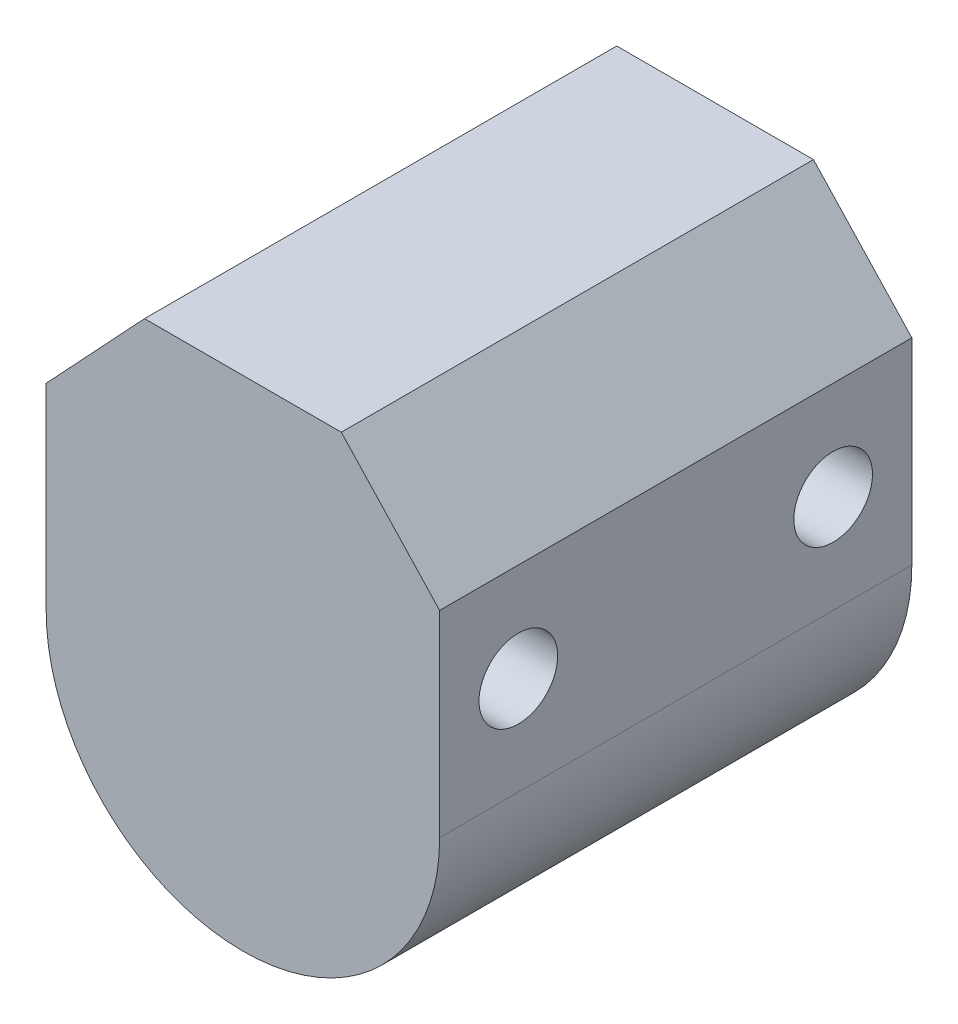
ISO-10303-21;
HEADER;
FILE_DESCRIPTION(('STEP AP214'),'2;1');
FILE_NAME('part.step','',(''),(''),'','','');
FILE_SCHEMA(('AUTOMOTIVE_DESIGN { 1 0 10303 214 1 1 1 1 }'));
ENDSEC;
DATA;
#1=APPLICATION_CONTEXT('core data for automotive mechanical design processes');
#2=APPLICATION_PROTOCOL_DEFINITION('international standard','automotive_design',2000,#1);
#3=PRODUCT_CONTEXT('',#1,'mechanical');
#4=PRODUCT('Part','Part','',(#3));
#5=PRODUCT_RELATED_PRODUCT_CATEGORY('part','',(#4));
#6=PRODUCT_DEFINITION_FORMATION('','',#4);
#7=PRODUCT_DEFINITION_CONTEXT('part definition',#1,'design');
#8=PRODUCT_DEFINITION('design','',#6,#7);
#9=PRODUCT_DEFINITION_SHAPE('','',#8);
#10=(LENGTH_UNIT() NAMED_UNIT(*) SI_UNIT(.MILLI.,.METRE.));
#11=(NAMED_UNIT(*) PLANE_ANGLE_UNIT() SI_UNIT($,.RADIAN.));
#12=(NAMED_UNIT(*) SI_UNIT($,.STERADIAN.) SOLID_ANGLE_UNIT());
#13=UNCERTAINTY_MEASURE_WITH_UNIT(LENGTH_MEASURE(1.E-05),#10,'distance_accuracy_value','');
#14=(GEOMETRIC_REPRESENTATION_CONTEXT(3) GLOBAL_UNCERTAINTY_ASSIGNED_CONTEXT((#13)) GLOBAL_UNIT_ASSIGNED_CONTEXT((#10,
#11,#12)) REPRESENTATION_CONTEXT('',''));
#15=CARTESIAN_POINT('',(0.,0.,0.));
#16=DIRECTION('',(0.,0.,1.));
#17=DIRECTION('',(1.,0.,0.));
#18=AXIS2_PLACEMENT_3D('',#15,#16,#17);
#19=CARTESIAN_POINT('',(20.,0.,24.));
#20=DIRECTION('',(1.,0.,0.));
#21=DIRECTION('',(0.,0.,-1.));
#22=AXIS2_PLACEMENT_3D('',#19,#20,#21);
#23=PLANE('',#22);
#24=CARTESIAN_POINT('',(20.,5.,4.));
#25=DIRECTION('',(1.,0.,0.));
#26=DIRECTION('',(0.,0.,-1.));
#27=AXIS2_PLACEMENT_3D('',#24,#25,#26);
#28=CIRCLE('',#27,2.);
#29=CARTESIAN_POINT('',(20.,5.,2.));
#30=VERTEX_POINT('',#29);
#31=EDGE_CURVE('E179',#30,#30,#28,.F.);
#32=ORIENTED_EDGE('',*,*,#31,.T.);
#33=EDGE_LOOP('',(#32));
#34=FACE_BOUND('',#33,.T.);
#35=DIRECTION('',(0.,-1.,0.));
#36=VECTOR('',#35,1.);
#37=CARTESIAN_POINT('',(20.,0.,0.));
#38=LINE('',#37,#36);
#39=CARTESIAN_POINT('',(20.,10.,0.));
#40=VERTEX_POINT('',#39);
#41=CARTESIAN_POINT('',(20.,0.,0.));
#42=VERTEX_POINT('',#41);
#43=EDGE_CURVE('E136',#40,#42,#38,.T.);
#44=ORIENTED_EDGE('',*,*,#43,.F.);
#45=DIRECTION('',(0.,0.,-1.));
#46=VECTOR('',#45,1.);
#47=CARTESIAN_POINT('',(20.,10.,24.));
#48=LINE('',#47,#46);
#49=CARTESIAN_POINT('',(20.,10.,24.));
#50=VERTEX_POINT('',#49);
#51=EDGE_CURVE('E55',#50,#40,#48,.T.);
#52=ORIENTED_EDGE('',*,*,#51,.F.);
#53=DIRECTION('',(0.,-1.,0.));
#54=VECTOR('',#53,1.);
#55=CARTESIAN_POINT('',(20.,0.,24.));
#56=LINE('',#55,#54);
#57=CARTESIAN_POINT('',(20.,0.,24.));
#58=VERTEX_POINT('',#57);
#59=EDGE_CURVE('E194',#50,#58,#56,.T.);
#60=ORIENTED_EDGE('',*,*,#59,.T.);
#61=DIRECTION('',(0.,0.,-1.));
#62=VECTOR('',#61,1.);
#63=CARTESIAN_POINT('',(20.,0.,24.));
#64=LINE('',#63,#62);
#65=EDGE_CURVE('E11',#58,#42,#64,.T.);
#66=ORIENTED_EDGE('',*,*,#65,.T.);
#67=EDGE_LOOP('',(#44,#52,#60,#66));
#68=FACE_BOUND('',#67,.T.);
#69=CARTESIAN_POINT('',(20.,5.,20.));
#70=DIRECTION('',(1.,0.,0.));
#71=DIRECTION('',(0.,0.,-1.));
#72=AXIS2_PLACEMENT_3D('',#69,#70,#71);
#73=CIRCLE('',#72,2.);
#74=CARTESIAN_POINT('',(20.,5.,18.));
#75=VERTEX_POINT('',#74);
#76=EDGE_CURVE('E137',#75,#75,#73,.T.);
#77=ORIENTED_EDGE('',*,*,#76,.F.);
#78=EDGE_LOOP('',(#77));
#79=FACE_BOUND('',#78,.T.);
#80=ADVANCED_FACE('F45',(#34,#68,#79),#23,.T.);
#81=CARTESIAN_POINT('',(0.,0.,24.));
#82=DIRECTION('',(-1.,0.,0.));
#83=DIRECTION('',(0.,0.,1.));
#84=AXIS2_PLACEMENT_3D('',#81,#82,#83);
#85=PLANE('',#84);
#86=CARTESIAN_POINT('',(0.,5.,4.));
#87=DIRECTION('',(1.,0.,0.));
#88=DIRECTION('',(0.,0.,-1.));
#89=AXIS2_PLACEMENT_3D('',#86,#87,#88);
#90=CIRCLE('',#89,2.);
#91=CARTESIAN_POINT('',(0.,5.,2.));
#92=VERTEX_POINT('',#91);
#93=EDGE_CURVE('E180',#92,#92,#90,.F.);
#94=ORIENTED_EDGE('',*,*,#93,.F.);
#95=EDGE_LOOP('',(#94));
#96=FACE_BOUND('',#95,.T.);
#97=DIRECTION('',(0.,1.,0.));
#98=VECTOR('',#97,1.);
#99=CARTESIAN_POINT('',(0.,0.,0.));
#100=LINE('',#99,#98);
#101=CARTESIAN_POINT('',(0.,0.,0.));
#102=VERTEX_POINT('',#101);
#103=CARTESIAN_POINT('',(0.,10.,0.));
#104=VERTEX_POINT('',#103);
#105=EDGE_CURVE('E150',#102,#104,#100,.T.);
#106=ORIENTED_EDGE('',*,*,#105,.F.);
#107=DIRECTION('',(0.,0.,-1.));
#108=VECTOR('',#107,1.);
#109=CARTESIAN_POINT('',(0.,0.,24.));
#110=LINE('',#109,#108);
#111=CARTESIAN_POINT('',(0.,0.,24.));
#112=VERTEX_POINT('',#111);
#113=EDGE_CURVE('E63',#112,#102,#110,.T.);
#114=ORIENTED_EDGE('',*,*,#113,.F.);
#115=DIRECTION('',(0.,1.,0.));
#116=VECTOR('',#115,1.);
#117=CARTESIAN_POINT('',(0.,0.,24.));
#118=LINE('',#117,#116);
#119=CARTESIAN_POINT('',(0.,10.,24.));
#120=VERTEX_POINT('',#119);
#121=EDGE_CURVE('E127',#112,#120,#118,.T.);
#122=ORIENTED_EDGE('',*,*,#121,.T.);
#123=DIRECTION('',(0.,0.,-1.));
#124=VECTOR('',#123,1.);
#125=CARTESIAN_POINT('',(0.,10.,24.));
#126=LINE('',#125,#124);
#127=EDGE_CURVE('E82',#120,#104,#126,.T.);
#128=ORIENTED_EDGE('',*,*,#127,.T.);
#129=EDGE_LOOP('',(#106,#114,#122,#128));
#130=FACE_BOUND('',#129,.T.);
#131=CARTESIAN_POINT('',(0.,5.,20.));
#132=DIRECTION('',(1.,0.,0.));
#133=DIRECTION('',(0.,0.,-1.));
#134=AXIS2_PLACEMENT_3D('',#131,#132,#133);
#135=CIRCLE('',#134,2.);
#136=CARTESIAN_POINT('',(0.,5.,18.));
#137=VERTEX_POINT('',#136);
#138=EDGE_CURVE('E176',#137,#137,#135,.T.);
#139=ORIENTED_EDGE('',*,*,#138,.T.);
#140=EDGE_LOOP('',(#139));
#141=FACE_BOUND('',#140,.T.);
#142=ADVANCED_FACE('F169',(#96,#130,#141),#85,.T.);
#143=CARTESIAN_POINT('',(10.,0.,24.));
#144=DIRECTION('',(0.,0.,-1.));
#145=DIRECTION('',(-1.,0.,0.));
#146=AXIS2_PLACEMENT_3D('',#143,#144,#145);
#147=CYLINDRICAL_SURFACE('',#146,10.);
#148=CARTESIAN_POINT('',(10.,0.,0.));
#149=DIRECTION('',(0.,0.,1.));
#150=DIRECTION('',(1.,0.,0.));
#151=AXIS2_PLACEMENT_3D('',#148,#149,#150);
#152=CIRCLE('',#151,10.);
#153=EDGE_CURVE('E133',#102,#42,#152,.T.);
#154=ORIENTED_EDGE('',*,*,#153,.T.);
#155=ORIENTED_EDGE('',*,*,#65,.F.);
#156=CARTESIAN_POINT('',(10.,0.,24.));
#157=DIRECTION('',(0.,0.,1.));
#158=DIRECTION('',(1.,0.,0.));
#159=AXIS2_PLACEMENT_3D('',#156,#157,#158);
#160=CIRCLE('',#159,10.);
#161=EDGE_CURVE('E94',#112,#58,#160,.T.);
#162=ORIENTED_EDGE('',*,*,#161,.F.);
#163=ORIENTED_EDGE('',*,*,#113,.T.);
#164=EDGE_LOOP('',(#154,#155,#162,#163));
#165=FACE_BOUND('',#164,.T.);
#166=ADVANCED_FACE('F47',(#165),#147,.T.);
#167=CARTESIAN_POINT('',(15.6540352826612,14.6453037807226,24.));
#168=DIRECTION('',(0.730243340053161,0.683187137106667,0.));
#169=DIRECTION('',(-0.683187137106667,0.730243340053161,0.));
#170=AXIS2_PLACEMENT_3D('',#167,#168,#169);
#171=PLANE('',#170);
#172=DIRECTION('',(0.683187137106667,-0.730243340053161,0.));
#173=VECTOR('',#172,1.);
#174=CARTESIAN_POINT('',(15.6540352826612,14.6453037807226,0.));
#175=LINE('',#174,#173);
#176=CARTESIAN_POINT('',(15.,15.3443873602903,0.));
#177=VERTEX_POINT('',#176);
#178=EDGE_CURVE('E141',#177,#40,#175,.T.);
#179=ORIENTED_EDGE('',*,*,#178,.F.);
#180=DIRECTION('',(0.,0.,-1.));
#181=VECTOR('',#180,1.);
#182=CARTESIAN_POINT('',(15.,15.3443873602903,24.));
#183=LINE('',#182,#181);
#184=CARTESIAN_POINT('',(15.,15.3443873602903,24.));
#185=VERTEX_POINT('',#184);
#186=EDGE_CURVE('E115',#185,#177,#183,.T.);
#187=ORIENTED_EDGE('',*,*,#186,.F.);
#188=DIRECTION('',(0.683187137106667,-0.730243340053161,0.));
#189=VECTOR('',#188,1.);
#190=CARTESIAN_POINT('',(15.6540352826612,14.6453037807226,24.));
#191=LINE('',#190,#189);
#192=EDGE_CURVE('E122',#185,#50,#191,.T.);
#193=ORIENTED_EDGE('',*,*,#192,.T.);
#194=ORIENTED_EDGE('',*,*,#51,.T.);
#195=EDGE_LOOP('',(#179,#187,#193,#194));
#196=FACE_BOUND('',#195,.T.);
#197=ADVANCED_FACE('F163',(#196),#171,.T.);
#198=CARTESIAN_POINT('',(0.,15.3443873602903,24.));
#199=DIRECTION('',(0.,1.,0.));
#200=DIRECTION('',(0.,0.,1.));
#201=AXIS2_PLACEMENT_3D('',#198,#199,#200);
#202=PLANE('',#201);
#203=DIRECTION('',(1.,0.,0.));
#204=VECTOR('',#203,1.);
#205=CARTESIAN_POINT('',(0.,15.3443873602903,0.));
#206=LINE('',#205,#204);
#207=CARTESIAN_POINT('',(5.,15.3443873602903,0.));
#208=VERTEX_POINT('',#207);
#209=EDGE_CURVE('E110',#208,#177,#206,.T.);
#210=ORIENTED_EDGE('',*,*,#209,.F.);
#211=DIRECTION('',(0.,0.,-1.));
#212=VECTOR('',#211,1.);
#213=CARTESIAN_POINT('',(5.,15.3443873602903,24.));
#214=LINE('',#213,#212);
#215=CARTESIAN_POINT('',(5.,15.3443873602903,24.));
#216=VERTEX_POINT('',#215);
#217=EDGE_CURVE('E105',#216,#208,#214,.T.);
#218=ORIENTED_EDGE('',*,*,#217,.F.);
#219=DIRECTION('',(1.,0.,0.));
#220=VECTOR('',#219,1.);
#221=CARTESIAN_POINT('',(0.,15.3443873602903,24.));
#222=LINE('',#221,#220);
#223=EDGE_CURVE('E108',#216,#185,#222,.T.);
#224=ORIENTED_EDGE('',*,*,#223,.T.);
#225=ORIENTED_EDGE('',*,*,#186,.T.);
#226=EDGE_LOOP('',(#210,#218,#224,#225));
#227=FACE_BOUND('',#226,.T.);
#228=ADVANCED_FACE('F107',(#227),#202,.T.);
#229=CARTESIAN_POINT('',(-4.98892856882129,4.66744664308003,24.));
#230=DIRECTION('',(-0.730243340053161,0.683187137106666,0.));
#231=DIRECTION('',(-0.683187137106667,-0.730243340053161,0.));
#232=AXIS2_PLACEMENT_3D('',#229,#230,#231);
#233=PLANE('',#232);
#234=DIRECTION('',(0.683187137106667,0.730243340053161,0.));
#235=VECTOR('',#234,1.);
#236=CARTESIAN_POINT('',(-4.98892856882129,4.66744664308003,0.));
#237=LINE('',#236,#235);
#238=EDGE_CURVE('E147',#104,#208,#237,.T.);
#239=ORIENTED_EDGE('',*,*,#238,.F.);
#240=ORIENTED_EDGE('',*,*,#127,.F.);
#241=DIRECTION('',(0.683187137106667,0.730243340053161,0.));
#242=VECTOR('',#241,1.);
#243=CARTESIAN_POINT('',(-4.98892856882129,4.66744664308003,24.));
#244=LINE('',#243,#242);
#245=EDGE_CURVE('E120',#120,#216,#244,.T.);
#246=ORIENTED_EDGE('',*,*,#245,.T.);
#247=ORIENTED_EDGE('',*,*,#217,.T.);
#248=EDGE_LOOP('',(#239,#240,#246,#247));
#249=FACE_BOUND('',#248,.T.);
#250=ADVANCED_FACE('F125',(#249),#233,.T.);
#251=CARTESIAN_POINT('',(0.,0.,24.));
#252=DIRECTION('',(0.,0.,1.));
#253=DIRECTION('',(1.,0.,0.));
#254=AXIS2_PLACEMENT_3D('',#251,#252,#253);
#255=PLANE('',#254);
#256=ORIENTED_EDGE('',*,*,#161,.T.);
#257=ORIENTED_EDGE('',*,*,#59,.F.);
#258=ORIENTED_EDGE('',*,*,#192,.F.);
#259=ORIENTED_EDGE('',*,*,#223,.F.);
#260=ORIENTED_EDGE('',*,*,#245,.F.);
#261=ORIENTED_EDGE('',*,*,#121,.F.);
#262=EDGE_LOOP('',(#256,#257,#258,#259,#260,#261));
#263=FACE_BOUND('',#262,.T.);
#264=ADVANCED_FACE('F119',(#263),#255,.T.);
#265=CARTESIAN_POINT('',(0.,0.,0.));
#266=DIRECTION('',(0.,0.,1.));
#267=DIRECTION('',(1.,0.,0.));
#268=AXIS2_PLACEMENT_3D('',#265,#266,#267);
#269=PLANE('',#268);
#270=ORIENTED_EDGE('',*,*,#153,.F.);
#271=ORIENTED_EDGE('',*,*,#105,.T.);
#272=ORIENTED_EDGE('',*,*,#238,.T.);
#273=ORIENTED_EDGE('',*,*,#209,.T.);
#274=ORIENTED_EDGE('',*,*,#178,.T.);
#275=ORIENTED_EDGE('',*,*,#43,.T.);
#276=EDGE_LOOP('',(#270,#271,#272,#273,#274,#275));
#277=FACE_BOUND('',#276,.T.);
#278=ADVANCED_FACE('F168',(#277),#269,.F.);
#279=CARTESIAN_POINT('',(0.,5.,4.));
#280=DIRECTION('',(1.,0.,0.));
#281=DIRECTION('',(0.,0.,-1.));
#282=AXIS2_PLACEMENT_3D('',#279,#280,#281);
#283=CYLINDRICAL_SURFACE('',#282,2.);
#284=ORIENTED_EDGE('',*,*,#31,.F.);
#285=EDGE_LOOP('',(#284));
#286=FACE_BOUND('',#285,.T.);
#287=ORIENTED_EDGE('',*,*,#93,.T.);
#288=EDGE_LOOP('',(#287));
#289=FACE_BOUND('',#288,.T.);
#290=ADVANCED_FACE('F213',(#286,#289),#283,.F.);
#291=CARTESIAN_POINT('',(0.,5.,20.));
#292=DIRECTION('',(1.,0.,0.));
#293=DIRECTION('',(0.,0.,-1.));
#294=AXIS2_PLACEMENT_3D('',#291,#292,#293);
#295=CYLINDRICAL_SURFACE('',#294,2.);
#296=ORIENTED_EDGE('',*,*,#76,.T.);
#297=EDGE_LOOP('',(#296));
#298=FACE_BOUND('',#297,.T.);
#299=ORIENTED_EDGE('',*,*,#138,.F.);
#300=EDGE_LOOP('',(#299));
#301=FACE_BOUND('',#300,.T.);
#302=ADVANCED_FACE('F199',(#298,#301),#295,.F.);
#303=CLOSED_SHELL('',(#80,#142,#166,#197,#228,#250,#264,#278,#290,#302));
#304=MANIFOLD_SOLID_BREP('B2',#303);
#305=ADVANCED_BREP_SHAPE_REPRESENTATION('',(#18,#304),#14);
#306=SHAPE_DEFINITION_REPRESENTATION(#9,#305);
ENDSEC;
END-ISO-10303-21;
